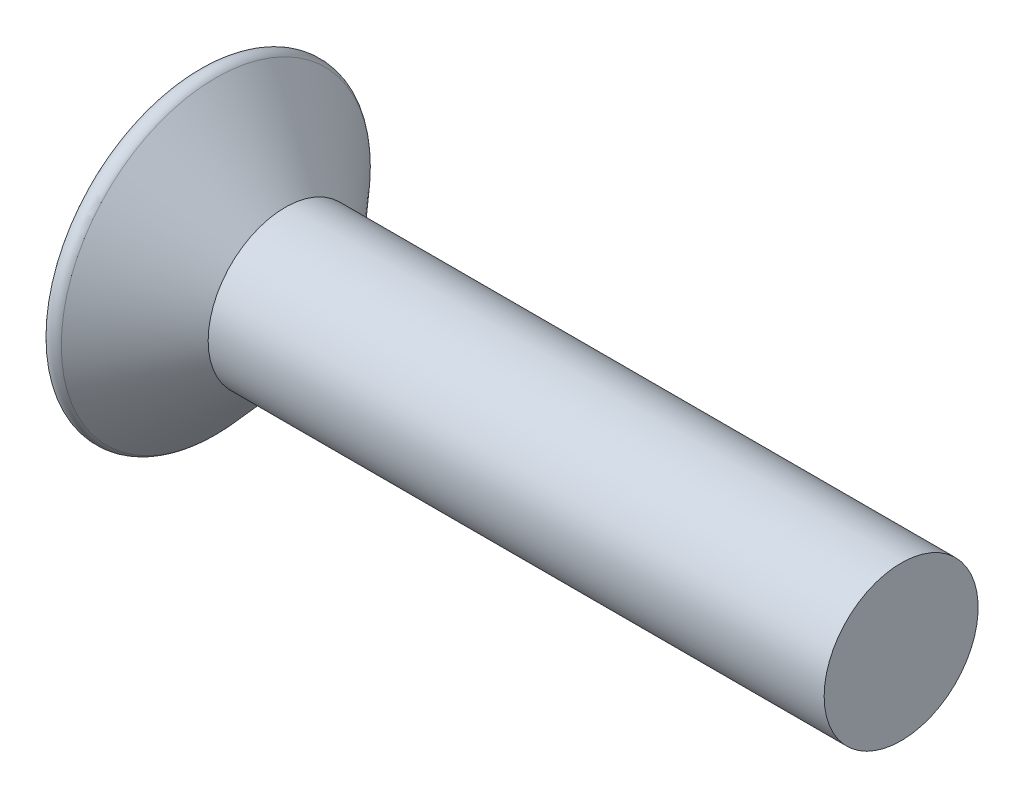
ISO-10303-21;
HEADER;
FILE_DESCRIPTION(('STEP AP214'),'2;1');
FILE_NAME('part.step','',(''),(''),'','','');
FILE_SCHEMA(('AUTOMOTIVE_DESIGN { 1 0 10303 214 1 1 1 1 }'));
ENDSEC;
DATA;
#1=APPLICATION_CONTEXT('core data for automotive mechanical design processes');
#2=APPLICATION_PROTOCOL_DEFINITION('international standard','automotive_design',2000,#1);
#3=PRODUCT_CONTEXT('',#1,'mechanical');
#4=PRODUCT('Part','Part','',(#3));
#5=PRODUCT_RELATED_PRODUCT_CATEGORY('part','',(#4));
#6=PRODUCT_DEFINITION_FORMATION('','',#4);
#7=PRODUCT_DEFINITION_CONTEXT('part definition',#1,'design');
#8=PRODUCT_DEFINITION('design','',#6,#7);
#9=PRODUCT_DEFINITION_SHAPE('','',#8);
#10=(LENGTH_UNIT() NAMED_UNIT(*) SI_UNIT(.MILLI.,.METRE.));
#11=(NAMED_UNIT(*) PLANE_ANGLE_UNIT() SI_UNIT($,.RADIAN.));
#12=(NAMED_UNIT(*) SI_UNIT($,.STERADIAN.) SOLID_ANGLE_UNIT());
#13=UNCERTAINTY_MEASURE_WITH_UNIT(LENGTH_MEASURE(1.E-05),#10,'distance_accuracy_value','');
#14=(GEOMETRIC_REPRESENTATION_CONTEXT(3) GLOBAL_UNCERTAINTY_ASSIGNED_CONTEXT((#13)) GLOBAL_UNIT_ASSIGNED_CONTEXT((#10,
#11,#12)) REPRESENTATION_CONTEXT('',''));
#15=CARTESIAN_POINT('',(0.,0.,0.));
#16=DIRECTION('',(0.,0.,1.));
#17=DIRECTION('',(1.,0.,0.));
#18=AXIS2_PLACEMENT_3D('',#15,#16,#17);
#19=CARTESIAN_POINT('',(0.,0.,0.));
#20=DIRECTION('',(1.,0.,0.));
#21=DIRECTION('',(0.,0.,-1.));
#22=AXIS2_PLACEMENT_3D('',#19,#20,#21);
#23=PLANE('',#22);
#24=DIRECTION('',(0.,0.866025403784439,0.5));
#25=VECTOR('',#24,1.);
#26=CARTESIAN_POINT('',(0.,-0.866025403784438,0.5));
#27=LINE('',#26,#25);
#28=CARTESIAN_POINT('',(0.,-0.866025403784438,0.5));
#29=VERTEX_POINT('',#28);
#30=CARTESIAN_POINT('',(0.,0.,1.));
#31=VERTEX_POINT('',#30);
#32=EDGE_CURVE('E135',#29,#31,#27,.T.);
#33=ORIENTED_EDGE('',*,*,#32,.F.);
#34=DIRECTION('',(0.,0.,1.));
#35=VECTOR('',#34,1.);
#36=CARTESIAN_POINT('',(0.,-0.866025403784438,-0.5));
#37=LINE('',#36,#35);
#38=CARTESIAN_POINT('',(0.,-0.866025403784438,-0.5));
#39=VERTEX_POINT('',#38);
#40=EDGE_CURVE('E55',#39,#29,#37,.T.);
#41=ORIENTED_EDGE('',*,*,#40,.F.);
#42=DIRECTION('',(0.,-0.866025403784439,0.5));
#43=VECTOR('',#42,1.);
#44=CARTESIAN_POINT('',(0.,0.,-1.));
#45=LINE('',#44,#43);
#46=CARTESIAN_POINT('',(0.,0.,-1.));
#47=VERTEX_POINT('',#46);
#48=EDGE_CURVE('E148',#47,#39,#45,.T.);
#49=ORIENTED_EDGE('',*,*,#48,.F.);
#50=DIRECTION('',(0.,-0.866025403784439,-0.5));
#51=VECTOR('',#50,1.);
#52=CARTESIAN_POINT('',(0.,0.866025403784439,-0.5));
#53=LINE('',#52,#51);
#54=CARTESIAN_POINT('',(0.,0.866025403784439,-0.5));
#55=VERTEX_POINT('',#54);
#56=EDGE_CURVE('E145',#55,#47,#53,.T.);
#57=ORIENTED_EDGE('',*,*,#56,.F.);
#58=DIRECTION('',(0.,0.,-1.));
#59=VECTOR('',#58,1.);
#60=CARTESIAN_POINT('',(0.,0.866025403784439,0.499999999999999));
#61=LINE('',#60,#59);
#62=CARTESIAN_POINT('',(0.,0.866025403784439,0.499999999999999));
#63=VERTEX_POINT('',#62);
#64=EDGE_CURVE('E103',#63,#55,#61,.T.);
#65=ORIENTED_EDGE('',*,*,#64,.F.);
#66=DIRECTION('',(0.,0.866025403784438,-0.5));
#67=VECTOR('',#66,1.);
#68=CARTESIAN_POINT('',(0.,0.,1.));
#69=LINE('',#68,#67);
#70=EDGE_CURVE('E139',#31,#63,#69,.T.);
#71=ORIENTED_EDGE('',*,*,#70,.F.);
#72=EDGE_LOOP('',(#33,#41,#49,#57,#65,#71));
#73=FACE_BOUND('',#72,.T.);
#74=CARTESIAN_POINT('',(0.,0.,0.));
#75=DIRECTION('',(1.,0.,0.));
#76=DIRECTION('',(0.,0.,-1.));
#77=AXIS2_PLACEMENT_3D('',#74,#75,#76);
#78=CIRCLE('',#77,2.87652826390631);
#79=CARTESIAN_POINT('',(0.,0.,-2.87652826390631));
#80=VERTEX_POINT('',#79);
#81=EDGE_CURVE('E48',#80,#80,#78,.F.);
#82=ORIENTED_EDGE('',*,*,#81,.T.);
#83=EDGE_LOOP('',(#82));
#84=FACE_BOUND('',#83,.T.);
#85=ADVANCED_FACE('F39',(#73,#84),#23,.F.);
#86=CARTESIAN_POINT('',(1.7,0.,0.));
#87=DIRECTION('',(-1.,0.,0.));
#88=DIRECTION('',(0.,0.,1.));
#89=AXIS2_PLACEMENT_3D('',#86,#87,#88);
#90=CONICAL_SURFACE('',#89,1.5,0.840896668643165);
#91=CARTESIAN_POINT('',(0.34904826270502,0.,0.));
#92=DIRECTION('',(1.,0.,0.));
#93=DIRECTION('',(0.,0.,-1.));
#94=AXIS2_PLACEMENT_3D('',#91,#92,#93);
#95=CIRCLE('',#94,3.00988723580027);
#96=CARTESIAN_POINT('',(0.34904826270502,0.,-3.00988723580027));
#97=VERTEX_POINT('',#96);
#98=EDGE_CURVE('E11',#97,#97,#95,.T.);
#99=ORIENTED_EDGE('',*,*,#98,.T.);
#100=EDGE_LOOP('',(#99));
#101=FACE_BOUND('',#100,.T.);
#102=CARTESIAN_POINT('',(1.7,0.,0.));
#103=DIRECTION('',(-1.,0.,0.));
#104=DIRECTION('',(0.,0.,1.));
#105=AXIS2_PLACEMENT_3D('',#102,#103,#104);
#106=CIRCLE('',#105,1.5);
#107=CARTESIAN_POINT('',(1.7,0.,1.5));
#108=VERTEX_POINT('',#107);
#109=EDGE_CURVE('E167',#108,#108,#106,.T.);
#110=ORIENTED_EDGE('',*,*,#109,.T.);
#111=EDGE_LOOP('',(#110));
#112=FACE_BOUND('',#111,.T.);
#113=ADVANCED_FACE('F190',(#101,#112),#90,.T.);
#114=CARTESIAN_POINT('',(0.,0.,0.));
#115=DIRECTION('',(-1.,0.,0.));
#116=DIRECTION('',(0.,0.,1.));
#117=AXIS2_PLACEMENT_3D('',#114,#115,#116);
#118=CYLINDRICAL_SURFACE('',#117,1.5);
#119=ORIENTED_EDGE('',*,*,#109,.F.);
#120=EDGE_LOOP('',(#119));
#121=FACE_BOUND('',#120,.T.);
#122=CARTESIAN_POINT('',(13.7,0.,0.));
#123=DIRECTION('',(-1.,0.,0.));
#124=DIRECTION('',(0.,0.,1.));
#125=AXIS2_PLACEMENT_3D('',#122,#123,#124);
#126=CIRCLE('',#125,1.5);
#127=CARTESIAN_POINT('',(13.7,0.,1.5));
#128=VERTEX_POINT('',#127);
#129=EDGE_CURVE('E154',#128,#128,#126,.T.);
#130=ORIENTED_EDGE('',*,*,#129,.T.);
#131=EDGE_LOOP('',(#130));
#132=FACE_BOUND('',#131,.T.);
#133=ADVANCED_FACE('F185',(#121,#132),#118,.T.);
#134=CARTESIAN_POINT('',(13.7,1.5,0.));
#135=DIRECTION('',(-1.,0.,0.));
#136=DIRECTION('',(0.,0.,1.));
#137=AXIS2_PLACEMENT_3D('',#134,#135,#136);
#138=PLANE('',#137);
#139=ORIENTED_EDGE('',*,*,#129,.F.);
#140=EDGE_LOOP('',(#139));
#141=FACE_BOUND('',#140,.T.);
#142=ADVANCED_FACE('F177',(#141),#138,.F.);
#143=CARTESIAN_POINT('',(0.2,0.,0.));
#144=DIRECTION('',(1.,0.,0.));
#145=DIRECTION('',(0.,0.,-1.));
#146=AXIS2_PLACEMENT_3D('',#143,#144,#145);
#147=TOROIDAL_SURFACE('',#146,2.87652826390631,0.2);
#148=ORIENTED_EDGE('',*,*,#98,.F.);
#149=EDGE_LOOP('',(#148));
#150=FACE_BOUND('',#149,.T.);
#151=ORIENTED_EDGE('',*,*,#81,.F.);
#152=EDGE_LOOP('',(#151));
#153=FACE_BOUND('',#152,.T.);
#154=ADVANCED_FACE('F41',(#150,#153),#147,.T.);
#155=CARTESIAN_POINT('',(0.2,-0.866025403784438,-0.5));
#156=DIRECTION('',(0.,-1.,0.));
#157=DIRECTION('',(0.,0.,-1.));
#158=AXIS2_PLACEMENT_3D('',#155,#156,#157);
#159=PLANE('',#158);
#160=ORIENTED_EDGE('',*,*,#40,.T.);
#161=DIRECTION('',(-1.,0.,0.));
#162=VECTOR('',#161,1.);
#163=CARTESIAN_POINT('',(0.2,-0.866025403784438,0.5));
#164=LINE('',#163,#162);
#165=CARTESIAN_POINT('',(0.2,-0.866025403784438,0.5));
#166=VERTEX_POINT('',#165);
#167=EDGE_CURVE('E85',#166,#29,#164,.T.);
#168=ORIENTED_EDGE('',*,*,#167,.F.);
#169=DIRECTION('',(0.,0.,1.));
#170=VECTOR('',#169,1.);
#171=CARTESIAN_POINT('',(0.2,-0.866025403784438,-0.5));
#172=LINE('',#171,#170);
#173=CARTESIAN_POINT('',(0.2,-0.866025403784438,-0.5));
#174=VERTEX_POINT('',#173);
#175=EDGE_CURVE('E151',#174,#166,#172,.T.);
#176=ORIENTED_EDGE('',*,*,#175,.F.);
#177=DIRECTION('',(-1.,0.,0.));
#178=VECTOR('',#177,1.);
#179=CARTESIAN_POINT('',(0.2,-0.866025403784438,-0.5));
#180=LINE('',#179,#178);
#181=EDGE_CURVE('E63',#174,#39,#180,.T.);
#182=ORIENTED_EDGE('',*,*,#181,.T.);
#183=EDGE_LOOP('',(#160,#168,#176,#182));
#184=FACE_BOUND('',#183,.T.);
#185=ADVANCED_FACE('F176',(#184),#159,.F.);
#186=CARTESIAN_POINT('',(0.2,0.,-1.));
#187=DIRECTION('',(0.,-0.5,-0.866025403784439));
#188=DIRECTION('',(0.,0.866025403784439,-0.5));
#189=AXIS2_PLACEMENT_3D('',#186,#187,#188);
#190=PLANE('',#189);
#191=ORIENTED_EDGE('',*,*,#48,.T.);
#192=ORIENTED_EDGE('',*,*,#181,.F.);
#193=DIRECTION('',(0.,-0.866025403784439,0.5));
#194=VECTOR('',#193,1.);
#195=CARTESIAN_POINT('',(0.2,0.,-1.));
#196=LINE('',#195,#194);
#197=CARTESIAN_POINT('',(0.2,0.,-1.));
#198=VERTEX_POINT('',#197);
#199=EDGE_CURVE('E117',#198,#174,#196,.T.);
#200=ORIENTED_EDGE('',*,*,#199,.F.);
#201=DIRECTION('',(-1.,0.,0.));
#202=VECTOR('',#201,1.);
#203=CARTESIAN_POINT('',(0.2,0.,-1.));
#204=LINE('',#203,#202);
#205=EDGE_CURVE('E108',#198,#47,#204,.T.);
#206=ORIENTED_EDGE('',*,*,#205,.T.);
#207=EDGE_LOOP('',(#191,#192,#200,#206));
#208=FACE_BOUND('',#207,.T.);
#209=ADVANCED_FACE('F183',(#208),#190,.F.);
#210=CARTESIAN_POINT('',(0.2,0.866025403784439,-0.5));
#211=DIRECTION('',(0.,0.5,-0.866025403784439));
#212=DIRECTION('',(0.,0.866025403784439,0.5));
#213=AXIS2_PLACEMENT_3D('',#210,#211,#212);
#214=PLANE('',#213);
#215=ORIENTED_EDGE('',*,*,#56,.T.);
#216=ORIENTED_EDGE('',*,*,#205,.F.);
#217=DIRECTION('',(0.,-0.866025403784439,-0.5));
#218=VECTOR('',#217,1.);
#219=CARTESIAN_POINT('',(0.2,0.866025403784439,-0.5));
#220=LINE('',#219,#218);
#221=CARTESIAN_POINT('',(0.2,0.866025403784439,-0.5));
#222=VERTEX_POINT('',#221);
#223=EDGE_CURVE('E112',#222,#198,#220,.T.);
#224=ORIENTED_EDGE('',*,*,#223,.F.);
#225=DIRECTION('',(-1.,0.,0.));
#226=VECTOR('',#225,1.);
#227=CARTESIAN_POINT('',(0.2,0.866025403784439,-0.5));
#228=LINE('',#227,#226);
#229=EDGE_CURVE('E96',#222,#55,#228,.T.);
#230=ORIENTED_EDGE('',*,*,#229,.T.);
#231=EDGE_LOOP('',(#215,#216,#224,#230));
#232=FACE_BOUND('',#231,.T.);
#233=ADVANCED_FACE('F113',(#232),#214,.F.);
#234=CARTESIAN_POINT('',(0.2,0.866025403784439,0.499999999999999));
#235=DIRECTION('',(0.,1.,0.));
#236=DIRECTION('',(0.,0.,1.));
#237=AXIS2_PLACEMENT_3D('',#234,#235,#236);
#238=PLANE('',#237);
#239=ORIENTED_EDGE('',*,*,#64,.T.);
#240=ORIENTED_EDGE('',*,*,#229,.F.);
#241=DIRECTION('',(0.,0.,-1.));
#242=VECTOR('',#241,1.);
#243=CARTESIAN_POINT('',(0.2,0.866025403784439,0.499999999999999));
#244=LINE('',#243,#242);
#245=CARTESIAN_POINT('',(0.2,0.866025403784439,0.499999999999999));
#246=VERTEX_POINT('',#245);
#247=EDGE_CURVE('E100',#246,#222,#244,.T.);
#248=ORIENTED_EDGE('',*,*,#247,.F.);
#249=DIRECTION('',(-1.,0.,0.));
#250=VECTOR('',#249,1.);
#251=CARTESIAN_POINT('',(0.2,0.866025403784439,0.499999999999999));
#252=LINE('',#251,#250);
#253=EDGE_CURVE('E109',#246,#63,#252,.T.);
#254=ORIENTED_EDGE('',*,*,#253,.T.);
#255=EDGE_LOOP('',(#239,#240,#248,#254));
#256=FACE_BOUND('',#255,.T.);
#257=ADVANCED_FACE('F98',(#256),#238,.F.);
#258=CARTESIAN_POINT('',(0.2,0.,1.));
#259=DIRECTION('',(0.,0.5,0.866025403784438));
#260=DIRECTION('',(0.,-0.866025403784439,0.5));
#261=AXIS2_PLACEMENT_3D('',#258,#259,#260);
#262=PLANE('',#261);
#263=ORIENTED_EDGE('',*,*,#70,.T.);
#264=ORIENTED_EDGE('',*,*,#253,.F.);
#265=DIRECTION('',(0.,0.866025403784438,-0.5));
#266=VECTOR('',#265,1.);
#267=CARTESIAN_POINT('',(0.2,0.,1.));
#268=LINE('',#267,#266);
#269=CARTESIAN_POINT('',(0.2,0.,1.));
#270=VERTEX_POINT('',#269);
#271=EDGE_CURVE('E123',#270,#246,#268,.T.);
#272=ORIENTED_EDGE('',*,*,#271,.F.);
#273=DIRECTION('',(-1.,0.,0.));
#274=VECTOR('',#273,1.);
#275=CARTESIAN_POINT('',(0.2,0.,1.));
#276=LINE('',#275,#274);
#277=EDGE_CURVE('E159',#270,#31,#276,.T.);
#278=ORIENTED_EDGE('',*,*,#277,.T.);
#279=EDGE_LOOP('',(#263,#264,#272,#278));
#280=FACE_BOUND('',#279,.T.);
#281=ADVANCED_FACE('F205',(#280),#262,.F.);
#282=CARTESIAN_POINT('',(0.2,-0.866025403784438,0.5));
#283=DIRECTION('',(0.,-0.5,0.866025403784439));
#284=DIRECTION('',(0.,-0.866025403784439,-0.5));
#285=AXIS2_PLACEMENT_3D('',#282,#283,#284);
#286=PLANE('',#285);
#287=ORIENTED_EDGE('',*,*,#32,.T.);
#288=ORIENTED_EDGE('',*,*,#277,.F.);
#289=DIRECTION('',(0.,0.866025403784439,0.5));
#290=VECTOR('',#289,1.);
#291=CARTESIAN_POINT('',(0.2,-0.866025403784438,0.5));
#292=LINE('',#291,#290);
#293=EDGE_CURVE('E127',#166,#270,#292,.T.);
#294=ORIENTED_EDGE('',*,*,#293,.F.);
#295=ORIENTED_EDGE('',*,*,#167,.T.);
#296=EDGE_LOOP('',(#287,#288,#294,#295));
#297=FACE_BOUND('',#296,.T.);
#298=ADVANCED_FACE('F202',(#297),#286,.F.);
#299=CARTESIAN_POINT('',(0.2,0.,0.));
#300=DIRECTION('',(-1.,0.,0.));
#301=DIRECTION('',(0.,0.,1.));
#302=AXIS2_PLACEMENT_3D('',#299,#300,#301);
#303=PLANE('',#302);
#304=ORIENTED_EDGE('',*,*,#175,.T.);
#305=ORIENTED_EDGE('',*,*,#293,.T.);
#306=ORIENTED_EDGE('',*,*,#271,.T.);
#307=ORIENTED_EDGE('',*,*,#247,.T.);
#308=ORIENTED_EDGE('',*,*,#223,.T.);
#309=ORIENTED_EDGE('',*,*,#199,.T.);
#310=EDGE_LOOP('',(#304,#305,#306,#307,#308,#309));
#311=FACE_BOUND('',#310,.T.);
#312=ADVANCED_FACE('F120',(#311),#303,.T.);
#313=CLOSED_SHELL('',(#85,#113,#133,#142,#154,#185,#209,#233,#257,#281,#298,#312));
#314=MANIFOLD_SOLID_BREP('B2',#313);
#315=ADVANCED_BREP_SHAPE_REPRESENTATION('',(#18,#314),#14);
#316=SHAPE_DEFINITION_REPRESENTATION(#9,#315);
ENDSEC;
END-ISO-10303-21;
